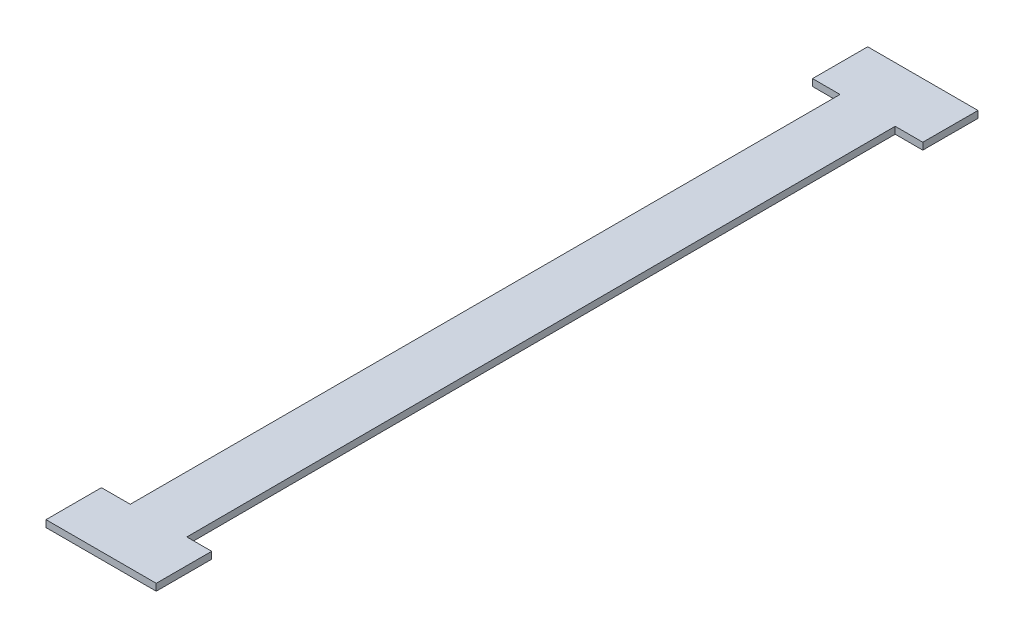
ISO-10303-21;
HEADER;
FILE_DESCRIPTION(('STEP AP214'),'2;1');
FILE_NAME('part.step','',(''),(''),'','','');
FILE_SCHEMA(('AUTOMOTIVE_DESIGN { 1 0 10303 214 1 1 1 1 }'));
ENDSEC;
DATA;
#1=APPLICATION_CONTEXT('core data for automotive mechanical design processes');
#2=APPLICATION_PROTOCOL_DEFINITION('international standard','automotive_design',2000,#1);
#3=PRODUCT_CONTEXT('',#1,'mechanical');
#4=PRODUCT('Part','Part','',(#3));
#5=PRODUCT_RELATED_PRODUCT_CATEGORY('part','',(#4));
#6=PRODUCT_DEFINITION_FORMATION('','',#4);
#7=PRODUCT_DEFINITION_CONTEXT('part definition',#1,'design');
#8=PRODUCT_DEFINITION('design','',#6,#7);
#9=PRODUCT_DEFINITION_SHAPE('','',#8);
#10=(LENGTH_UNIT() NAMED_UNIT(*) SI_UNIT(.MILLI.,.METRE.));
#11=(NAMED_UNIT(*) PLANE_ANGLE_UNIT() SI_UNIT($,.RADIAN.));
#12=(NAMED_UNIT(*) SI_UNIT($,.STERADIAN.) SOLID_ANGLE_UNIT());
#13=UNCERTAINTY_MEASURE_WITH_UNIT(LENGTH_MEASURE(1.E-05),#10,'distance_accuracy_value','');
#14=(GEOMETRIC_REPRESENTATION_CONTEXT(3) GLOBAL_UNCERTAINTY_ASSIGNED_CONTEXT((#13)) GLOBAL_UNIT_ASSIGNED_CONTEXT((#10,
#11,#12)) REPRESENTATION_CONTEXT('',''));
#15=CARTESIAN_POINT('',(0.,0.,0.));
#16=DIRECTION('',(0.,0.,1.));
#17=DIRECTION('',(1.,0.,0.));
#18=AXIS2_PLACEMENT_3D('',#15,#16,#17);
#19=CARTESIAN_POINT('',(-0.0574571642438375,3.175,-30.3973027389441));
#20=DIRECTION('',(0.,0.,1.));
#21=DIRECTION('',(1.,0.,0.));
#22=AXIS2_PLACEMENT_3D('',#19,#20,#21);
#23=PLANE('',#22);
#24=DIRECTION('',(-1.,0.,0.));
#25=VECTOR('',#24,1.);
#26=CARTESIAN_POINT('',(-0.0574571642438375,0.,-30.3973027389441));
#27=LINE('',#26,#25);
#28=CARTESIAN_POINT('',(-0.0574571642438375,0.,-30.3973027389441));
#29=VERTEX_POINT('',#28);
#30=CARTESIAN_POINT('',(-13.3194380057404,0.,-30.3973027389441));
#31=VERTEX_POINT('',#30);
#32=EDGE_CURVE('E152',#29,#31,#27,.T.);
#33=ORIENTED_EDGE('',*,*,#32,.T.);
#34=DIRECTION('',(0.,-1.,0.));
#35=VECTOR('',#34,1.);
#36=CARTESIAN_POINT('',(-13.3194380057404,3.175,-30.3973027389441));
#37=LINE('',#36,#35);
#38=CARTESIAN_POINT('',(-13.3194380057404,3.175,-30.3973027389441));
#39=VERTEX_POINT('',#38);
#40=EDGE_CURVE('E11',#39,#31,#37,.T.);
#41=ORIENTED_EDGE('',*,*,#40,.F.);
#42=DIRECTION('',(-1.,0.,0.));
#43=VECTOR('',#42,1.);
#44=CARTESIAN_POINT('',(-0.0574571642438375,3.175,-30.3973027389441));
#45=LINE('',#44,#43);
#46=CARTESIAN_POINT('',(-0.0574571642438375,3.175,-30.3973027389441));
#47=VERTEX_POINT('',#46);
#48=EDGE_CURVE('E174',#47,#39,#45,.T.);
#49=ORIENTED_EDGE('',*,*,#48,.F.);
#50=DIRECTION('',(0.,-1.,0.));
#51=VECTOR('',#50,1.);
#52=CARTESIAN_POINT('',(-0.0574571642438375,3.175,-30.3973027389441));
#53=LINE('',#52,#51);
#54=EDGE_CURVE('E148',#47,#29,#53,.T.);
#55=ORIENTED_EDGE('',*,*,#54,.T.);
#56=EDGE_LOOP('',(#33,#41,#49,#55));
#57=FACE_BOUND('',#56,.T.);
#58=ADVANCED_FACE('F32',(#57),#23,.F.);
#59=CARTESIAN_POINT('',(-13.3194380057404,3.175,-30.3973027389441));
#60=DIRECTION('',(1.,0.,0.));
#61=DIRECTION('',(0.,0.,-1.));
#62=AXIS2_PLACEMENT_3D('',#59,#60,#61);
#63=PLANE('',#62);
#64=DIRECTION('',(0.,0.,1.));
#65=VECTOR('',#64,1.);
#66=CARTESIAN_POINT('',(-13.3194380057404,0.,-30.3973027389441));
#67=LINE('',#66,#65);
#68=CARTESIAN_POINT('',(-13.3194380057404,0.,-4.86277530074772));
#69=VERTEX_POINT('',#68);
#70=EDGE_CURVE('E155',#31,#69,#67,.T.);
#71=ORIENTED_EDGE('',*,*,#70,.T.);
#72=DIRECTION('',(0.,-1.,0.));
#73=VECTOR('',#72,1.);
#74=CARTESIAN_POINT('',(-13.3194380057404,3.175,-4.86277530074772));
#75=LINE('',#74,#73);
#76=CARTESIAN_POINT('',(-13.3194380057404,3.175,-4.86277530074772));
#77=VERTEX_POINT('',#76);
#78=EDGE_CURVE('E40',#77,#69,#75,.T.);
#79=ORIENTED_EDGE('',*,*,#78,.F.);
#80=DIRECTION('',(0.,0.,1.));
#81=VECTOR('',#80,1.);
#82=CARTESIAN_POINT('',(-13.3194380057404,3.175,-30.3973027389441));
#83=LINE('',#82,#81);
#84=EDGE_CURVE('E103',#39,#77,#83,.T.);
#85=ORIENTED_EDGE('',*,*,#84,.F.);
#86=ORIENTED_EDGE('',*,*,#40,.T.);
#87=EDGE_LOOP('',(#71,#79,#85,#86));
#88=FACE_BOUND('',#87,.T.);
#89=ADVANCED_FACE('F252',(#88),#63,.F.);
#90=CARTESIAN_POINT('',(-13.3194380057404,3.175,-4.86277530074772));
#91=DIRECTION('',(0.,0.,-1.));
#92=DIRECTION('',(-1.,0.,0.));
#93=AXIS2_PLACEMENT_3D('',#90,#91,#92);
#94=PLANE('',#93);
#95=DIRECTION('',(1.,0.,0.));
#96=VECTOR('',#95,1.);
#97=CARTESIAN_POINT('',(-13.3194380057404,0.,-4.86277530074772));
#98=LINE('',#97,#96);
#99=CARTESIAN_POINT('',(37.4431414826109,0.,-4.86277530074772));
#100=VERTEX_POINT('',#99);
#101=EDGE_CURVE('E157',#69,#100,#98,.T.);
#102=ORIENTED_EDGE('',*,*,#101,.T.);
#103=DIRECTION('',(0.,-1.,0.));
#104=VECTOR('',#103,1.);
#105=CARTESIAN_POINT('',(37.4431414826109,3.175,-4.86277530074772));
#106=LINE('',#105,#104);
#107=CARTESIAN_POINT('',(37.4431414826109,3.175,-4.86277530074772));
#108=VERTEX_POINT('',#107);
#109=EDGE_CURVE('E193',#108,#100,#106,.T.);
#110=ORIENTED_EDGE('',*,*,#109,.F.);
#111=DIRECTION('',(1.,0.,0.));
#112=VECTOR('',#111,1.);
#113=CARTESIAN_POINT('',(-13.3194380057404,3.175,-4.86277530074772));
#114=LINE('',#113,#112);
#115=EDGE_CURVE('E201',#77,#108,#114,.T.);
#116=ORIENTED_EDGE('',*,*,#115,.F.);
#117=ORIENTED_EDGE('',*,*,#78,.T.);
#118=EDGE_LOOP('',(#102,#110,#116,#117));
#119=FACE_BOUND('',#118,.T.);
#120=ADVANCED_FACE('F199',(#119),#94,.F.);
#121=CARTESIAN_POINT('',(37.4431414826109,3.175,-4.86277530074772));
#122=DIRECTION('',(-1.,0.,0.));
#123=DIRECTION('',(0.,0.,1.));
#124=AXIS2_PLACEMENT_3D('',#121,#122,#123);
#125=PLANE('',#124);
#126=DIRECTION('',(0.,0.,-1.));
#127=VECTOR('',#126,1.);
#128=CARTESIAN_POINT('',(37.4431414826109,0.,-4.86277530074772));
#129=LINE('',#128,#127);
#130=CARTESIAN_POINT('',(37.4431414826109,0.,-30.3973027389441));
#131=VERTEX_POINT('',#130);
#132=EDGE_CURVE('E159',#100,#131,#129,.T.);
#133=ORIENTED_EDGE('',*,*,#132,.T.);
#134=DIRECTION('',(0.,-1.,0.));
#135=VECTOR('',#134,1.);
#136=CARTESIAN_POINT('',(37.4431414826109,3.175,-30.3973027389441));
#137=LINE('',#136,#135);
#138=CARTESIAN_POINT('',(37.4431414826109,3.175,-30.3973027389441));
#139=VERTEX_POINT('',#138);
#140=EDGE_CURVE('E190',#139,#131,#137,.T.);
#141=ORIENTED_EDGE('',*,*,#140,.F.);
#142=DIRECTION('',(0.,0.,-1.));
#143=VECTOR('',#142,1.);
#144=CARTESIAN_POINT('',(37.4431414826109,3.175,-4.86277530074772));
#145=LINE('',#144,#143);
#146=EDGE_CURVE('E219',#108,#139,#145,.T.);
#147=ORIENTED_EDGE('',*,*,#146,.F.);
#148=ORIENTED_EDGE('',*,*,#109,.T.);
#149=EDGE_LOOP('',(#133,#141,#147,#148));
#150=FACE_BOUND('',#149,.T.);
#151=ADVANCED_FACE('F210',(#150),#125,.F.);
#152=CARTESIAN_POINT('',(37.4431414826109,3.175,-30.3973027389441));
#153=DIRECTION('',(0.,0.,1.));
#154=DIRECTION('',(1.,0.,0.));
#155=AXIS2_PLACEMENT_3D('',#152,#153,#154);
#156=PLANE('',#155);
#157=DIRECTION('',(-1.,0.,0.));
#158=VECTOR('',#157,1.);
#159=CARTESIAN_POINT('',(37.4431414826109,0.,-30.3973027389441));
#160=LINE('',#159,#158);
#161=CARTESIAN_POINT('',(26.0113746516346,0.,-30.3973027389441));
#162=VERTEX_POINT('',#161);
#163=EDGE_CURVE('E161',#131,#162,#160,.T.);
#164=ORIENTED_EDGE('',*,*,#163,.T.);
#165=DIRECTION('',(0.,-1.,0.));
#166=VECTOR('',#165,1.);
#167=CARTESIAN_POINT('',(26.0113746516346,3.175,-30.3973027389441));
#168=LINE('',#167,#166);
#169=CARTESIAN_POINT('',(26.0113746516346,3.175,-30.3973027389441));
#170=VERTEX_POINT('',#169);
#171=EDGE_CURVE('E187',#170,#162,#168,.T.);
#172=ORIENTED_EDGE('',*,*,#171,.F.);
#173=DIRECTION('',(-1.,0.,0.));
#174=VECTOR('',#173,1.);
#175=CARTESIAN_POINT('',(37.4431414826109,3.175,-30.3973027389441));
#176=LINE('',#175,#174);
#177=EDGE_CURVE('E216',#139,#170,#176,.T.);
#178=ORIENTED_EDGE('',*,*,#177,.F.);
#179=ORIENTED_EDGE('',*,*,#140,.T.);
#180=EDGE_LOOP('',(#164,#172,#178,#179));
#181=FACE_BOUND('',#180,.T.);
#182=ADVANCED_FACE('F214',(#181),#156,.F.);
#183=CARTESIAN_POINT('',(26.0113746516346,3.175,-30.3973027389441));
#184=DIRECTION('',(-0.999997812079539,0.,0.00209184993152977));
#185=DIRECTION('',(0.00209184993152977,0.,0.999997812079539));
#186=AXIS2_PLACEMENT_3D('',#183,#184,#185);
#187=PLANE('',#186);
#188=DIRECTION('',(-0.00209184993152977,0.,-0.999997812079539));
#189=VECTOR('',#188,1.);
#190=CARTESIAN_POINT('',(26.0113746516346,0.,-30.3973027389441));
#191=LINE('',#190,#189);
#192=CARTESIAN_POINT('',(25.3275702078435,0.,-357.286405716486));
#193=VERTEX_POINT('',#192);
#194=EDGE_CURVE('E163',#162,#193,#191,.T.);
#195=ORIENTED_EDGE('',*,*,#194,.T.);
#196=DIRECTION('',(0.,-1.,0.));
#197=VECTOR('',#196,1.);
#198=CARTESIAN_POINT('',(25.3275702078435,3.175,-357.286405716486));
#199=LINE('',#198,#197);
#200=CARTESIAN_POINT('',(25.3275702078435,3.175,-357.286405716486));
#201=VERTEX_POINT('',#200);
#202=EDGE_CURVE('E184',#201,#193,#199,.T.);
#203=ORIENTED_EDGE('',*,*,#202,.F.);
#204=DIRECTION('',(-0.00209184993152977,0.,-0.999997812079539));
#205=VECTOR('',#204,1.);
#206=CARTESIAN_POINT('',(26.0113746516346,3.175,-30.3973027389441));
#207=LINE('',#206,#205);
#208=EDGE_CURVE('E218',#170,#201,#207,.T.);
#209=ORIENTED_EDGE('',*,*,#208,.F.);
#210=ORIENTED_EDGE('',*,*,#171,.T.);
#211=EDGE_LOOP('',(#195,#203,#209,#210));
#212=FACE_BOUND('',#211,.T.);
#213=ADVANCED_FACE('F265',(#212),#187,.F.);
#214=CARTESIAN_POINT('',(38.0410837394546,3.175,-357.286405716486));
#215=DIRECTION('',(0.,0.,-1.));
#216=DIRECTION('',(-1.,0.,0.));
#217=AXIS2_PLACEMENT_3D('',#214,#215,#216);
#218=PLANE('',#217);
#219=DIRECTION('',(1.,0.,0.));
#220=VECTOR('',#219,1.);
#221=CARTESIAN_POINT('',(38.0410837394546,0.,-357.286405716486));
#222=LINE('',#221,#220);
#223=CARTESIAN_POINT('',(38.0410837394546,0.,-357.286405716486));
#224=VERTEX_POINT('',#223);
#225=EDGE_CURVE('E165',#193,#224,#222,.T.);
#226=ORIENTED_EDGE('',*,*,#225,.T.);
#227=DIRECTION('',(0.,-1.,0.));
#228=VECTOR('',#227,1.);
#229=CARTESIAN_POINT('',(38.0410837394546,3.175,-357.286405716486));
#230=LINE('',#229,#228);
#231=CARTESIAN_POINT('',(38.0410837394546,3.175,-357.286405716486));
#232=VERTEX_POINT('',#231);
#233=EDGE_CURVE('E181',#232,#224,#230,.T.);
#234=ORIENTED_EDGE('',*,*,#233,.F.);
#235=DIRECTION('',(1.,0.,0.));
#236=VECTOR('',#235,1.);
#237=CARTESIAN_POINT('',(38.0410837394546,3.175,-357.286405716486));
#238=LINE('',#237,#236);
#239=EDGE_CURVE('E221',#201,#232,#238,.T.);
#240=ORIENTED_EDGE('',*,*,#239,.F.);
#241=ORIENTED_EDGE('',*,*,#202,.T.);
#242=EDGE_LOOP('',(#226,#234,#240,#241));
#243=FACE_BOUND('',#242,.T.);
#244=ADVANCED_FACE('F268',(#243),#218,.F.);
#245=CARTESIAN_POINT('',(38.0841552986324,3.175,-382.672528004012));
#246=DIRECTION('',(-0.999998560679477,0.,-0.00169665523139725));
#247=DIRECTION('',(-0.00169665523139726,0.,0.999998560679477));
#248=AXIS2_PLACEMENT_3D('',#245,#246,#247);
#249=PLANE('',#248);
#250=DIRECTION('',(0.00169665523139726,0.,-0.999998560679477));
#251=VECTOR('',#250,1.);
#252=CARTESIAN_POINT('',(38.0841552986324,0.,-382.672528004012));
#253=LINE('',#252,#251);
#254=CARTESIAN_POINT('',(38.0841552986324,0.,-382.672528004012));
#255=VERTEX_POINT('',#254);
#256=EDGE_CURVE('E167',#224,#255,#253,.T.);
#257=ORIENTED_EDGE('',*,*,#256,.T.);
#258=DIRECTION('',(0.,-1.,0.));
#259=VECTOR('',#258,1.);
#260=CARTESIAN_POINT('',(38.0841552986324,3.175,-382.672528004012));
#261=LINE('',#260,#259);
#262=CARTESIAN_POINT('',(38.0841552986324,3.175,-382.672528004012));
#263=VERTEX_POINT('',#262);
#264=EDGE_CURVE('E178',#263,#255,#261,.T.);
#265=ORIENTED_EDGE('',*,*,#264,.F.);
#266=DIRECTION('',(0.00169665523139726,0.,-0.999998560679477));
#267=VECTOR('',#266,1.);
#268=CARTESIAN_POINT('',(38.0841552986324,3.175,-382.672528004012));
#269=LINE('',#268,#267);
#270=EDGE_CURVE('E227',#232,#263,#269,.T.);
#271=ORIENTED_EDGE('',*,*,#270,.F.);
#272=ORIENTED_EDGE('',*,*,#233,.T.);
#273=EDGE_LOOP('',(#257,#265,#271,#272));
#274=FACE_BOUND('',#273,.T.);
#275=ADVANCED_FACE('F233',(#274),#249,.F.);
#276=CARTESIAN_POINT('',(-12.7221824096585,3.175,-382.672528004012));
#277=DIRECTION('',(0.,0.,1.));
#278=DIRECTION('',(1.,0.,0.));
#279=AXIS2_PLACEMENT_3D('',#276,#277,#278);
#280=PLANE('',#279);
#281=DIRECTION('',(-1.,0.,0.));
#282=VECTOR('',#281,1.);
#283=CARTESIAN_POINT('',(-12.7221824096585,0.,-382.672528004012));
#284=LINE('',#283,#282);
#285=CARTESIAN_POINT('',(-12.7221824096585,0.,-382.672528004012));
#286=VERTEX_POINT('',#285);
#287=EDGE_CURVE('E169',#255,#286,#284,.T.);
#288=ORIENTED_EDGE('',*,*,#287,.T.);
#289=DIRECTION('',(0.,-1.,0.));
#290=VECTOR('',#289,1.);
#291=CARTESIAN_POINT('',(-12.7221824096585,3.175,-382.672528004012));
#292=LINE('',#291,#290);
#293=CARTESIAN_POINT('',(-12.7221824096585,3.175,-382.672528004012));
#294=VERTEX_POINT('',#293);
#295=EDGE_CURVE('E143',#294,#286,#292,.T.);
#296=ORIENTED_EDGE('',*,*,#295,.F.);
#297=DIRECTION('',(-1.,0.,0.));
#298=VECTOR('',#297,1.);
#299=CARTESIAN_POINT('',(-12.7221824096585,3.175,-382.672528004012));
#300=LINE('',#299,#298);
#301=EDGE_CURVE('E134',#263,#294,#300,.T.);
#302=ORIENTED_EDGE('',*,*,#301,.F.);
#303=ORIENTED_EDGE('',*,*,#264,.T.);
#304=EDGE_LOOP('',(#288,#296,#302,#303));
#305=FACE_BOUND('',#304,.T.);
#306=ADVANCED_FACE('F237',(#305),#280,.F.);
#307=CARTESIAN_POINT('',(-12.7221824096585,3.175,-357.286405716486));
#308=DIRECTION('',(1.,0.,0.));
#309=DIRECTION('',(0.,0.,-1.));
#310=AXIS2_PLACEMENT_3D('',#307,#308,#309);
#311=PLANE('',#310);
#312=DIRECTION('',(0.,0.,1.));
#313=VECTOR('',#312,1.);
#314=CARTESIAN_POINT('',(-12.7221824096585,0.,-357.286405716486));
#315=LINE('',#314,#313);
#316=CARTESIAN_POINT('',(-12.7221824096585,0.,-357.286405716486));
#317=VERTEX_POINT('',#316);
#318=EDGE_CURVE('E142',#286,#317,#315,.T.);
#319=ORIENTED_EDGE('',*,*,#318,.T.);
#320=DIRECTION('',(0.,-1.,0.));
#321=VECTOR('',#320,1.);
#322=CARTESIAN_POINT('',(-12.7221824096585,3.175,-357.286405716486));
#323=LINE('',#322,#321);
#324=CARTESIAN_POINT('',(-12.7221824096585,3.175,-357.286405716486));
#325=VERTEX_POINT('',#324);
#326=EDGE_CURVE('E139',#325,#317,#323,.T.);
#327=ORIENTED_EDGE('',*,*,#326,.F.);
#328=DIRECTION('',(0.,0.,1.));
#329=VECTOR('',#328,1.);
#330=CARTESIAN_POINT('',(-12.7221824096585,3.175,-357.286405716486));
#331=LINE('',#330,#329);
#332=EDGE_CURVE('E128',#294,#325,#331,.T.);
#333=ORIENTED_EDGE('',*,*,#332,.F.);
#334=ORIENTED_EDGE('',*,*,#295,.T.);
#335=EDGE_LOOP('',(#319,#327,#333,#334));
#336=FACE_BOUND('',#335,.T.);
#337=ADVANCED_FACE('F140',(#336),#311,.F.);
#338=CARTESIAN_POINT('',(-0.0574571642438375,3.175,-357.286405716486));
#339=DIRECTION('',(0.,0.,-1.));
#340=DIRECTION('',(-1.,0.,0.));
#341=AXIS2_PLACEMENT_3D('',#338,#339,#340);
#342=PLANE('',#341);
#343=DIRECTION('',(1.,0.,0.));
#344=VECTOR('',#343,1.);
#345=CARTESIAN_POINT('',(-0.0574571642438375,0.,-357.286405716486));
#346=LINE('',#345,#344);
#347=CARTESIAN_POINT('',(-0.0574571642438375,0.,-357.286405716486));
#348=VERTEX_POINT('',#347);
#349=EDGE_CURVE('E89',#317,#348,#346,.T.);
#350=ORIENTED_EDGE('',*,*,#349,.T.);
#351=DIRECTION('',(0.,-1.,0.));
#352=VECTOR('',#351,1.);
#353=CARTESIAN_POINT('',(-0.0574571642438375,3.175,-357.286405716486));
#354=LINE('',#353,#352);
#355=CARTESIAN_POINT('',(-0.0574571642438375,3.175,-357.286405716486));
#356=VERTEX_POINT('',#355);
#357=EDGE_CURVE('E144',#356,#348,#354,.T.);
#358=ORIENTED_EDGE('',*,*,#357,.F.);
#359=DIRECTION('',(1.,0.,0.));
#360=VECTOR('',#359,1.);
#361=CARTESIAN_POINT('',(-0.0574571642438375,3.175,-357.286405716486));
#362=LINE('',#361,#360);
#363=EDGE_CURVE('E132',#325,#356,#362,.T.);
#364=ORIENTED_EDGE('',*,*,#363,.F.);
#365=ORIENTED_EDGE('',*,*,#326,.T.);
#366=EDGE_LOOP('',(#350,#358,#364,#365));
#367=FACE_BOUND('',#366,.T.);
#368=ADVANCED_FACE('F146',(#367),#342,.F.);
#369=CARTESIAN_POINT('',(-0.0574571642438375,3.175,-357.286405716486));
#370=DIRECTION('',(1.,0.,0.));
#371=DIRECTION('',(0.,0.,-1.));
#372=AXIS2_PLACEMENT_3D('',#369,#370,#371);
#373=PLANE('',#372);
#374=DIRECTION('',(0.,0.,1.));
#375=VECTOR('',#374,1.);
#376=CARTESIAN_POINT('',(-0.0574571642438375,0.,-357.286405716486));
#377=LINE('',#376,#375);
#378=EDGE_CURVE('E95',#348,#29,#377,.T.);
#379=ORIENTED_EDGE('',*,*,#378,.T.);
#380=ORIENTED_EDGE('',*,*,#54,.F.);
#381=DIRECTION('',(0.,0.,1.));
#382=VECTOR('',#381,1.);
#383=CARTESIAN_POINT('',(-0.0574571642438375,3.175,-357.286405716486));
#384=LINE('',#383,#382);
#385=EDGE_CURVE('E48',#356,#47,#384,.T.);
#386=ORIENTED_EDGE('',*,*,#385,.F.);
#387=ORIENTED_EDGE('',*,*,#357,.T.);
#388=EDGE_LOOP('',(#379,#380,#386,#387));
#389=FACE_BOUND('',#388,.T.);
#390=ADVANCED_FACE('F241',(#389),#373,.F.);
#391=CARTESIAN_POINT('',(-13.3194380057404,3.175,-30.3973027389441));
#392=DIRECTION('',(0.,1.,0.));
#393=DIRECTION('',(0.,0.,1.));
#394=AXIS2_PLACEMENT_3D('',#391,#392,#393);
#395=PLANE('',#394);
#396=ORIENTED_EDGE('',*,*,#48,.T.);
#397=ORIENTED_EDGE('',*,*,#84,.T.);
#398=ORIENTED_EDGE('',*,*,#115,.T.);
#399=ORIENTED_EDGE('',*,*,#146,.T.);
#400=ORIENTED_EDGE('',*,*,#177,.T.);
#401=ORIENTED_EDGE('',*,*,#208,.T.);
#402=ORIENTED_EDGE('',*,*,#239,.T.);
#403=ORIENTED_EDGE('',*,*,#270,.T.);
#404=ORIENTED_EDGE('',*,*,#301,.T.);
#405=ORIENTED_EDGE('',*,*,#332,.T.);
#406=ORIENTED_EDGE('',*,*,#363,.T.);
#407=ORIENTED_EDGE('',*,*,#385,.T.);
#408=EDGE_LOOP('',(#396,#397,#398,#399,#400,#401,#402,#403,#404,#405,#406,#407));
#409=FACE_BOUND('',#408,.T.);
#410=ADVANCED_FACE('F130',(#409),#395,.T.);
#411=CARTESIAN_POINT('',(-13.3194380057404,0.,-30.3973027389441));
#412=DIRECTION('',(0.,1.,0.));
#413=DIRECTION('',(0.,0.,1.));
#414=AXIS2_PLACEMENT_3D('',#411,#412,#413);
#415=PLANE('',#414);
#416=ORIENTED_EDGE('',*,*,#32,.F.);
#417=ORIENTED_EDGE('',*,*,#378,.F.);
#418=ORIENTED_EDGE('',*,*,#349,.F.);
#419=ORIENTED_EDGE('',*,*,#318,.F.);
#420=ORIENTED_EDGE('',*,*,#287,.F.);
#421=ORIENTED_EDGE('',*,*,#256,.F.);
#422=ORIENTED_EDGE('',*,*,#225,.F.);
#423=ORIENTED_EDGE('',*,*,#194,.F.);
#424=ORIENTED_EDGE('',*,*,#163,.F.);
#425=ORIENTED_EDGE('',*,*,#132,.F.);
#426=ORIENTED_EDGE('',*,*,#101,.F.);
#427=ORIENTED_EDGE('',*,*,#70,.F.);
#428=EDGE_LOOP('',(#416,#417,#418,#419,#420,#421,#422,#423,#424,#425,#426,#427));
#429=FACE_BOUND('',#428,.T.);
#430=ADVANCED_FACE('F205',(#429),#415,.F.);
#431=CLOSED_SHELL('',(#58,#89,#120,#151,#182,#213,#244,#275,#306,#337,#368,#390,#410,#430));
#432=MANIFOLD_SOLID_BREP('B2',#431);
#433=ADVANCED_BREP_SHAPE_REPRESENTATION('',(#18,#432),#14);
#434=SHAPE_DEFINITION_REPRESENTATION(#9,#433);
ENDSEC;
END-ISO-10303-21;
